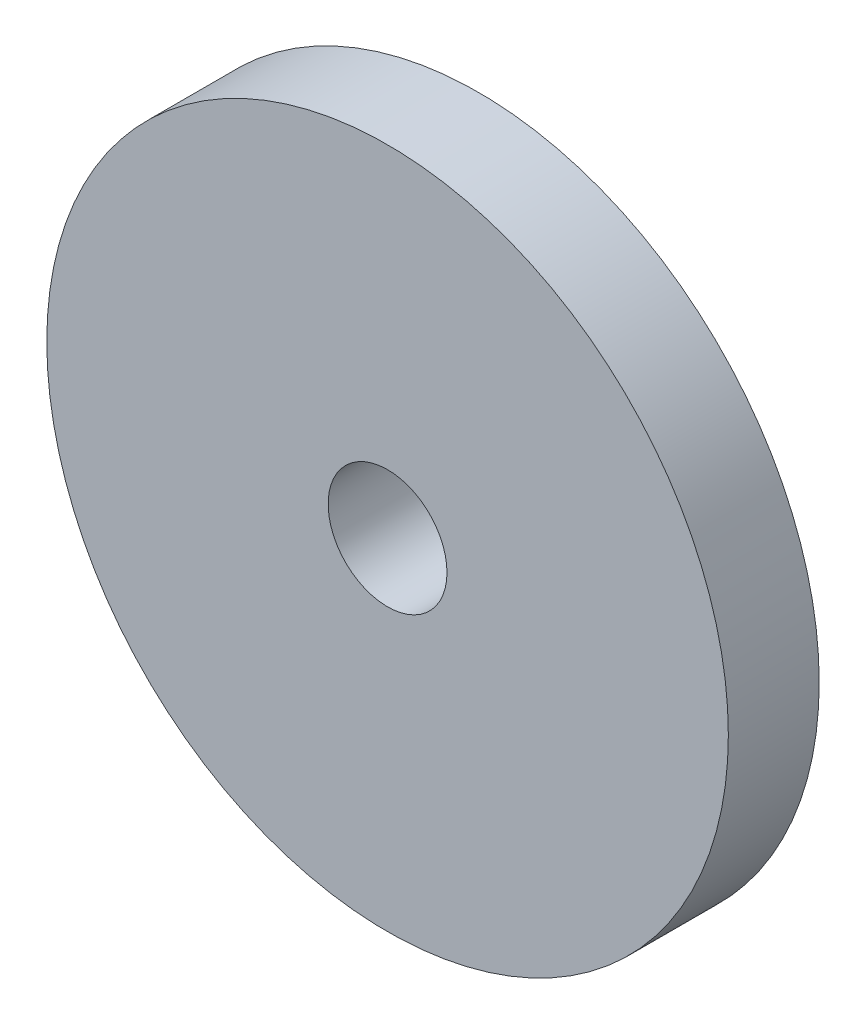
ISO-10303-21;
HEADER;
FILE_DESCRIPTION(('STEP AP214'),'2;1');
FILE_NAME('part.step','',(''),(''),'','','');
FILE_SCHEMA(('AUTOMOTIVE_DESIGN { 1 0 10303 214 1 1 1 1 }'));
ENDSEC;
DATA;
#1=APPLICATION_CONTEXT('core data for automotive mechanical design processes');
#2=APPLICATION_PROTOCOL_DEFINITION('international standard','automotive_design',2000,#1);
#3=PRODUCT_CONTEXT('',#1,'mechanical');
#4=PRODUCT('Part','Part','',(#3));
#5=PRODUCT_RELATED_PRODUCT_CATEGORY('part','',(#4));
#6=PRODUCT_DEFINITION_FORMATION('','',#4);
#7=PRODUCT_DEFINITION_CONTEXT('part definition',#1,'design');
#8=PRODUCT_DEFINITION('design','',#6,#7);
#9=PRODUCT_DEFINITION_SHAPE('','',#8);
#10=(LENGTH_UNIT() NAMED_UNIT(*) SI_UNIT(.MILLI.,.METRE.));
#11=(NAMED_UNIT(*) PLANE_ANGLE_UNIT() SI_UNIT($,.RADIAN.));
#12=(NAMED_UNIT(*) SI_UNIT($,.STERADIAN.) SOLID_ANGLE_UNIT());
#13=UNCERTAINTY_MEASURE_WITH_UNIT(LENGTH_MEASURE(1.E-05),#10,'distance_accuracy_value','');
#14=(GEOMETRIC_REPRESENTATION_CONTEXT(3) GLOBAL_UNCERTAINTY_ASSIGNED_CONTEXT((#13)) GLOBAL_UNIT_ASSIGNED_CONTEXT((#10,
#11,#12)) REPRESENTATION_CONTEXT('',''));
#15=CARTESIAN_POINT('',(0.,0.,0.));
#16=DIRECTION('',(0.,0.,1.));
#17=DIRECTION('',(1.,0.,0.));
#18=AXIS2_PLACEMENT_3D('',#15,#16,#17);
#19=CARTESIAN_POINT('',(0.,0.,12.6598181230512));
#20=DIRECTION('',(0.,0.,1.));
#21=DIRECTION('',(1.,0.,0.));
#22=AXIS2_PLACEMENT_3D('',#19,#20,#21);
#23=PLANE('',#22);
#24=CARTESIAN_POINT('',(0.,0.,12.6598181230512));
#25=DIRECTION('',(0.,0.,1.));
#26=DIRECTION('',(1.,0.,0.));
#27=AXIS2_PLACEMENT_3D('',#24,#25,#26);
#28=CIRCLE('',#27,60.);
#29=CARTESIAN_POINT('',(60.,0.,12.6598181230512));
#30=VERTEX_POINT('',#29);
#31=EDGE_CURVE('E50',#30,#30,#28,.T.);
#32=ORIENTED_EDGE('',*,*,#31,.F.);
#33=EDGE_LOOP('',(#32));
#34=FACE_BOUND('',#33,.T.);
#35=CARTESIAN_POINT('',(0.,0.,12.6598181230512));
#36=DIRECTION('',(0.,0.,1.));
#37=DIRECTION('',(1.,0.,0.));
#38=AXIS2_PLACEMENT_3D('',#35,#36,#37);
#39=CIRCLE('',#38,30.);
#40=CARTESIAN_POINT('',(30.,0.,12.6598181230512));
#41=VERTEX_POINT('',#40);
#42=EDGE_CURVE('E53',#41,#41,#39,.T.);
#43=ORIENTED_EDGE('',*,*,#42,.T.);
#44=EDGE_LOOP('',(#43));
#45=FACE_BOUND('',#44,.T.);
#46=ADVANCED_FACE('F35',(#34,#45),#23,.F.);
#47=CARTESIAN_POINT('',(0.,0.,28.6598181230512));
#48=DIRECTION('',(0.,0.,-1.));
#49=DIRECTION('',(-1.,0.,0.));
#50=AXIS2_PLACEMENT_3D('',#47,#48,#49);
#51=CYLINDRICAL_SURFACE('',#50,60.);
#52=CARTESIAN_POINT('',(0.,0.,28.6598181230512));
#53=DIRECTION('',(0.,0.,1.));
#54=DIRECTION('',(1.,0.,0.));
#55=AXIS2_PLACEMENT_3D('',#52,#53,#54);
#56=CIRCLE('',#55,60.);
#57=CARTESIAN_POINT('',(60.,0.,28.6598181230512));
#58=VERTEX_POINT('',#57);
#59=EDGE_CURVE('E47',#58,#58,#56,.T.);
#60=ORIENTED_EDGE('',*,*,#59,.F.);
#61=EDGE_LOOP('',(#60));
#62=FACE_BOUND('',#61,.T.);
#63=ORIENTED_EDGE('',*,*,#31,.T.);
#64=EDGE_LOOP('',(#63));
#65=FACE_BOUND('',#64,.T.);
#66=ADVANCED_FACE('F89',(#62,#65),#51,.T.);
#67=CARTESIAN_POINT('',(0.,0.,28.6598181230512));
#68=DIRECTION('',(0.,0.,1.));
#69=DIRECTION('',(1.,0.,0.));
#70=AXIS2_PLACEMENT_3D('',#67,#68,#69);
#71=PLANE('',#70);
#72=ORIENTED_EDGE('',*,*,#59,.T.);
#73=EDGE_LOOP('',(#72));
#74=FACE_BOUND('',#73,.T.);
#75=CARTESIAN_POINT('',(0.,0.,28.6598181230512));
#76=DIRECTION('',(0.,0.,1.));
#77=DIRECTION('',(1.,0.,0.));
#78=AXIS2_PLACEMENT_3D('',#75,#76,#77);
#79=CIRCLE('',#78,10.4619490646365);
#80=CARTESIAN_POINT('',(10.4619490646365,0.,28.6598181230512));
#81=VERTEX_POINT('',#80);
#82=EDGE_CURVE('E62',#81,#81,#79,.T.);
#83=ORIENTED_EDGE('',*,*,#82,.F.);
#84=EDGE_LOOP('',(#83));
#85=FACE_BOUND('',#84,.T.);
#86=ADVANCED_FACE('F95',(#74,#85),#71,.T.);
#87=CARTESIAN_POINT('',(0.,0.,20.6598181230512));
#88=DIRECTION('',(0.,0.,-1.));
#89=DIRECTION('',(-1.,0.,0.));
#90=AXIS2_PLACEMENT_3D('',#87,#88,#89);
#91=CYLINDRICAL_SURFACE('',#90,30.);
#92=CARTESIAN_POINT('',(0.,0.,19.3798181230512));
#93=DIRECTION('',(0.,0.,1.));
#94=DIRECTION('',(1.,0.,0.));
#95=AXIS2_PLACEMENT_3D('',#92,#93,#94);
#96=CIRCLE('',#95,30.);
#97=CARTESIAN_POINT('',(30.,0.,19.3798181230512));
#98=VERTEX_POINT('',#97);
#99=EDGE_CURVE('E43',#98,#98,#96,.T.);
#100=ORIENTED_EDGE('',*,*,#99,.T.);
#101=EDGE_LOOP('',(#100));
#102=FACE_BOUND('',#101,.T.);
#103=ORIENTED_EDGE('',*,*,#42,.F.);
#104=EDGE_LOOP('',(#103));
#105=FACE_BOUND('',#104,.T.);
#106=ADVANCED_FACE('F101',(#102,#105),#91,.F.);
#107=CARTESIAN_POINT('',(0.,0.,20.6598181230512));
#108=DIRECTION('',(0.,0.,1.));
#109=DIRECTION('',(1.,0.,0.));
#110=AXIS2_PLACEMENT_3D('',#107,#108,#109);
#111=PLANE('',#110);
#112=CARTESIAN_POINT('',(0.,0.,20.6598181230512));
#113=DIRECTION('',(0.,0.,1.));
#114=DIRECTION('',(1.,0.,0.));
#115=AXIS2_PLACEMENT_3D('',#112,#113,#114);
#116=CIRCLE('',#115,15.8136823587157);
#117=CARTESIAN_POINT('',(15.8136823587157,0.,20.6598181230512));
#118=VERTEX_POINT('',#117);
#119=EDGE_CURVE('E39',#118,#118,#116,.T.);
#120=ORIENTED_EDGE('',*,*,#119,.T.);
#121=EDGE_LOOP('',(#120));
#122=FACE_BOUND('',#121,.T.);
#123=CARTESIAN_POINT('',(0.,0.,20.6598181230512));
#124=DIRECTION('',(0.,0.,1.));
#125=DIRECTION('',(1.,0.,0.));
#126=AXIS2_PLACEMENT_3D('',#123,#124,#125);
#127=CIRCLE('',#126,28.72);
#128=CARTESIAN_POINT('',(28.72,0.,20.6598181230512));
#129=VERTEX_POINT('',#128);
#130=EDGE_CURVE('E10',#129,#129,#127,.F.);
#131=ORIENTED_EDGE('',*,*,#130,.T.);
#132=EDGE_LOOP('',(#131));
#133=FACE_BOUND('',#132,.T.);
#134=ADVANCED_FACE('F71',(#122,#133),#111,.F.);
#135=CARTESIAN_POINT('',(0.,0.,19.3798181230512));
#136=DIRECTION('',(0.,0.,1.));
#137=DIRECTION('',(1.,0.,0.));
#138=AXIS2_PLACEMENT_3D('',#135,#136,#137);
#139=TOROIDAL_SURFACE('',#138,28.72,1.28);
#140=ORIENTED_EDGE('',*,*,#130,.F.);
#141=EDGE_LOOP('',(#140));
#142=FACE_BOUND('',#141,.T.);
#143=ORIENTED_EDGE('',*,*,#99,.F.);
#144=EDGE_LOOP('',(#143));
#145=FACE_BOUND('',#144,.T.);
#146=ADVANCED_FACE('F37',(#142,#145),#139,.F.);
#147=CARTESIAN_POINT('',(0.,0.,-32.0680300024605));
#148=DIRECTION('',(0.,0.,1.));
#149=DIRECTION('',(1.,0.,0.));
#150=AXIS2_PLACEMENT_3D('',#147,#148,#149);
#151=CYLINDRICAL_SURFACE('',#150,15.8136823587157);
#152=CARTESIAN_POINT('',(0.,0.,12.6598181230512));
#153=DIRECTION('',(0.,0.,1.));
#154=DIRECTION('',(1.,0.,0.));
#155=AXIS2_PLACEMENT_3D('',#152,#153,#154);
#156=CIRCLE('',#155,15.8136823587157);
#157=CARTESIAN_POINT('',(15.8136823587157,0.,12.6598181230512));
#158=VERTEX_POINT('',#157);
#159=EDGE_CURVE('E61',#158,#158,#156,.F.);
#160=ORIENTED_EDGE('',*,*,#159,.F.);
#161=EDGE_LOOP('',(#160));
#162=FACE_BOUND('',#161,.T.);
#163=ORIENTED_EDGE('',*,*,#119,.F.);
#164=EDGE_LOOP('',(#163));
#165=FACE_BOUND('',#164,.T.);
#166=ADVANCED_FACE('F73',(#162,#165),#151,.T.);
#167=CARTESIAN_POINT('',(0.,0.,-32.0680300024605));
#168=DIRECTION('',(0.,0.,1.));
#169=DIRECTION('',(1.,0.,0.));
#170=AXIS2_PLACEMENT_3D('',#167,#168,#169);
#171=CYLINDRICAL_SURFACE('',#170,10.4619490646365);
#172=CARTESIAN_POINT('',(0.,0.,12.6598181230512));
#173=DIRECTION('',(0.,0.,1.));
#174=DIRECTION('',(1.,0.,0.));
#175=AXIS2_PLACEMENT_3D('',#172,#173,#174);
#176=CIRCLE('',#175,10.4619490646365);
#177=CARTESIAN_POINT('',(10.4619490646365,0.,12.6598181230512));
#178=VERTEX_POINT('',#177);
#179=EDGE_CURVE('E58',#178,#178,#176,.F.);
#180=ORIENTED_EDGE('',*,*,#179,.T.);
#181=EDGE_LOOP('',(#180));
#182=FACE_BOUND('',#181,.T.);
#183=ORIENTED_EDGE('',*,*,#82,.T.);
#184=EDGE_LOOP('',(#183));
#185=FACE_BOUND('',#184,.T.);
#186=ADVANCED_FACE('F75',(#182,#185),#171,.F.);
#187=CARTESIAN_POINT('',(0.,0.,12.6598181230512));
#188=DIRECTION('',(0.,0.,1.));
#189=DIRECTION('',(1.,0.,0.));
#190=AXIS2_PLACEMENT_3D('',#187,#188,#189);
#191=PLANE('',#190);
#192=ORIENTED_EDGE('',*,*,#159,.T.);
#193=EDGE_LOOP('',(#192));
#194=FACE_BOUND('',#193,.T.);
#195=ORIENTED_EDGE('',*,*,#179,.F.);
#196=EDGE_LOOP('',(#195));
#197=FACE_BOUND('',#196,.T.);
#198=ADVANCED_FACE('F82',(#194,#197),#191,.F.);
#199=CLOSED_SHELL('',(#46,#66,#86,#106,#134,#146,#166,#186,#198));
#200=MANIFOLD_SOLID_BREP('B2',#199);
#201=ADVANCED_BREP_SHAPE_REPRESENTATION('',(#18,#200),#14);
#202=SHAPE_DEFINITION_REPRESENTATION(#9,#201);
ENDSEC;
END-ISO-10303-21;
